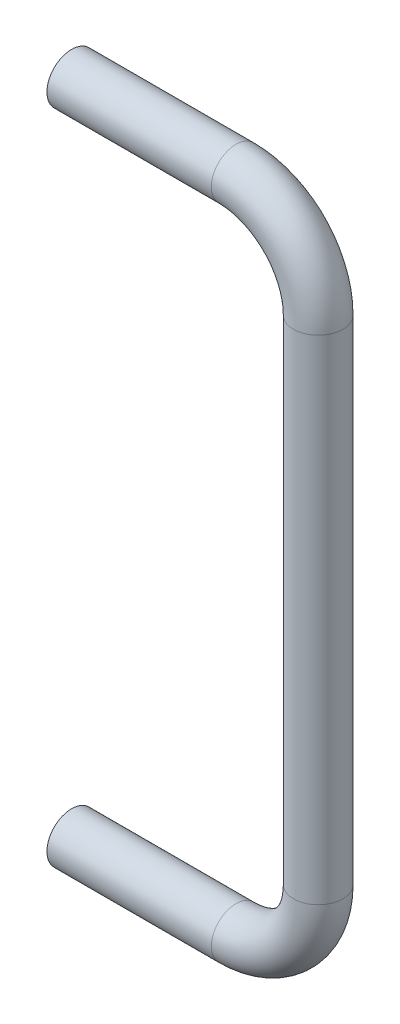
ISO-10303-21;
HEADER;
FILE_DESCRIPTION(('STEP AP214'),'2;1');
FILE_NAME('part.step','',(''),(''),'','','');
FILE_SCHEMA(('AUTOMOTIVE_DESIGN { 1 0 10303 214 1 1 1 1 }'));
ENDSEC;
DATA;
#1=APPLICATION_CONTEXT('core data for automotive mechanical design processes');
#2=APPLICATION_PROTOCOL_DEFINITION('international standard','automotive_design',2000,#1);
#3=PRODUCT_CONTEXT('',#1,'mechanical');
#4=PRODUCT('Part','Part','',(#3));
#5=PRODUCT_RELATED_PRODUCT_CATEGORY('part','',(#4));
#6=PRODUCT_DEFINITION_FORMATION('','',#4);
#7=PRODUCT_DEFINITION_CONTEXT('part definition',#1,'design');
#8=PRODUCT_DEFINITION('design','',#6,#7);
#9=PRODUCT_DEFINITION_SHAPE('','',#8);
#10=(LENGTH_UNIT() NAMED_UNIT(*) SI_UNIT(.MILLI.,.METRE.));
#11=(NAMED_UNIT(*) PLANE_ANGLE_UNIT() SI_UNIT($,.RADIAN.));
#12=(NAMED_UNIT(*) SI_UNIT($,.STERADIAN.) SOLID_ANGLE_UNIT());
#13=UNCERTAINTY_MEASURE_WITH_UNIT(LENGTH_MEASURE(1.E-05),#10,'distance_accuracy_value','');
#14=(GEOMETRIC_REPRESENTATION_CONTEXT(3) GLOBAL_UNCERTAINTY_ASSIGNED_CONTEXT((#13)) GLOBAL_UNIT_ASSIGNED_CONTEXT((#10,
#11,#12)) REPRESENTATION_CONTEXT('',''));
#15=CARTESIAN_POINT('',(0.,0.,0.));
#16=DIRECTION('',(0.,0.,1.));
#17=DIRECTION('',(1.,0.,0.));
#18=AXIS2_PLACEMENT_3D('',#15,#16,#17);
#19=CARTESIAN_POINT('',(0.,0.,0.));
#20=DIRECTION('',(1.,0.,0.));
#21=DIRECTION('',(0.,0.,-1.));
#22=AXIS2_PLACEMENT_3D('',#19,#20,#21);
#23=PLANE('',#22);
#24=CARTESIAN_POINT('',(0.,0.,0.));
#25=DIRECTION('',(1.,0.,0.));
#26=DIRECTION('',(0.,0.,-1.));
#27=AXIS2_PLACEMENT_3D('',#24,#25,#26);
#28=CIRCLE('',#27,3.);
#29=CARTESIAN_POINT('',(0.,0.,-3.));
#30=VERTEX_POINT('',#29);
#31=EDGE_CURVE('E64',#30,#30,#28,.T.);
#32=ORIENTED_EDGE('',*,*,#31,.F.);
#33=EDGE_LOOP('',(#32));
#34=FACE_BOUND('',#33,.T.);
#35=ADVANCED_FACE('F37',(#34),#23,.F.);
#36=CARTESIAN_POINT('',(0.,80.,0.));
#37=DIRECTION('',(-1.,0.,0.));
#38=DIRECTION('',(0.,0.,-1.));
#39=AXIS2_PLACEMENT_3D('',#36,#37,#38);
#40=PLANE('',#39);
#41=CARTESIAN_POINT('',(0.,80.,0.));
#42=DIRECTION('',(-1.,0.,0.));
#43=DIRECTION('',(0.,0.,-1.));
#44=AXIS2_PLACEMENT_3D('',#41,#42,#43);
#45=CIRCLE('',#44,3.);
#46=CARTESIAN_POINT('',(0.,80.,-3.));
#47=VERTEX_POINT('',#46);
#48=EDGE_CURVE('E10',#47,#47,#45,.T.);
#49=ORIENTED_EDGE('',*,*,#48,.T.);
#50=EDGE_LOOP('',(#49));
#51=FACE_BOUND('',#50,.T.);
#52=ADVANCED_FACE('F72',(#51),#40,.T.);
#53=CARTESIAN_POINT('',(0.,0.,0.));
#54=DIRECTION('',(1.,0.,0.));
#55=DIRECTION('',(0.,0.,-1.));
#56=AXIS2_PLACEMENT_3D('',#53,#54,#55);
#57=CYLINDRICAL_SURFACE('',#56,3.);
#58=CARTESIAN_POINT('',(20.,0.,0.));
#59=DIRECTION('',(1.,0.,0.));
#60=DIRECTION('',(0.,0.,-1.));
#61=AXIS2_PLACEMENT_3D('',#58,#59,#60);
#62=CIRCLE('',#61,3.);
#63=CARTESIAN_POINT('',(20.,-3.,0.));
#64=VERTEX_POINT('',#63);
#65=EDGE_CURVE('E60',#64,#64,#62,.T.);
#66=ORIENTED_EDGE('',*,*,#65,.F.);
#67=EDGE_LOOP('',(#66));
#68=FACE_BOUND('',#67,.T.);
#69=ORIENTED_EDGE('',*,*,#31,.T.);
#70=EDGE_LOOP('',(#69));
#71=FACE_BOUND('',#70,.T.);
#72=ADVANCED_FACE('F69',(#68,#71),#57,.T.);
#73=CARTESIAN_POINT('',(20.,10.,0.));
#74=DIRECTION('',(0.,0.,1.));
#75=DIRECTION('',(1.,0.,0.));
#76=AXIS2_PLACEMENT_3D('',#73,#74,#75);
#77=TOROIDAL_SURFACE('',#76,10.,3.);
#78=CARTESIAN_POINT('',(30.,10.,0.));
#79=DIRECTION('',(0.,1.,0.));
#80=DIRECTION('',(0.,0.,-1.));
#81=AXIS2_PLACEMENT_3D('',#78,#79,#80);
#82=CIRCLE('',#81,3.);
#83=CARTESIAN_POINT('',(33.,10.,0.));
#84=VERTEX_POINT('',#83);
#85=EDGE_CURVE('E54',#84,#84,#82,.T.);
#86=CARTESIAN_POINT('',(20.,10.,0.));
#87=DIRECTION('',(0.,0.,1.));
#88=DIRECTION('',(1.,0.,0.));
#89=AXIS2_PLACEMENT_3D('',#86,#87,#88);
#90=CIRCLE('',#89,13.);
#91=EDGE_CURVE('',#64,#84,#90,.T.);
#92=ORIENTED_EDGE('',*,*,#65,.T.);
#93=ORIENTED_EDGE('',*,*,#85,.F.);
#94=ORIENTED_EDGE('',*,*,#91,.T.);
#95=ORIENTED_EDGE('',*,*,#91,.F.);
#96=EDGE_LOOP('',(#92,#94,#93,#95));
#97=FACE_BOUND('',#96,.T.);
#98=ADVANCED_FACE('F90',(#97),#77,.T.);
#99=CARTESIAN_POINT('',(30.,10.,0.));
#100=DIRECTION('',(0.,1.,0.));
#101=DIRECTION('',(0.,0.,1.));
#102=AXIS2_PLACEMENT_3D('',#99,#100,#101);
#103=CYLINDRICAL_SURFACE('',#102,3.);
#104=CARTESIAN_POINT('',(30.,70.,0.));
#105=DIRECTION('',(0.,1.,0.));
#106=DIRECTION('',(0.,0.,-1.));
#107=AXIS2_PLACEMENT_3D('',#104,#105,#106);
#108=CIRCLE('',#107,3.);
#109=CARTESIAN_POINT('',(33.,70.,0.));
#110=VERTEX_POINT('',#109);
#111=EDGE_CURVE('E49',#110,#110,#108,.T.);
#112=ORIENTED_EDGE('',*,*,#111,.F.);
#113=EDGE_LOOP('',(#112));
#114=FACE_BOUND('',#113,.T.);
#115=ORIENTED_EDGE('',*,*,#85,.T.);
#116=EDGE_LOOP('',(#115));
#117=FACE_BOUND('',#116,.T.);
#118=ADVANCED_FACE('F84',(#114,#117),#103,.T.);
#119=CARTESIAN_POINT('',(20.,70.,0.));
#120=DIRECTION('',(0.,0.,1.));
#121=DIRECTION('',(1.,0.,0.));
#122=AXIS2_PLACEMENT_3D('',#119,#120,#121);
#123=TOROIDAL_SURFACE('',#122,10.,3.);
#124=CARTESIAN_POINT('',(20.,80.,0.));
#125=DIRECTION('',(-1.,0.,0.));
#126=DIRECTION('',(0.,0.,-1.));
#127=AXIS2_PLACEMENT_3D('',#124,#125,#126);
#128=CIRCLE('',#127,3.);
#129=CARTESIAN_POINT('',(20.,83.,0.));
#130=VERTEX_POINT('',#129);
#131=EDGE_CURVE('E44',#130,#130,#128,.T.);
#132=CARTESIAN_POINT('',(20.,70.,0.));
#133=DIRECTION('',(0.,0.,1.));
#134=DIRECTION('',(1.,0.,0.));
#135=AXIS2_PLACEMENT_3D('',#132,#133,#134);
#136=CIRCLE('',#135,13.);
#137=EDGE_CURVE('',#110,#130,#136,.T.);
#138=ORIENTED_EDGE('',*,*,#111,.T.);
#139=ORIENTED_EDGE('',*,*,#131,.F.);
#140=ORIENTED_EDGE('',*,*,#137,.T.);
#141=ORIENTED_EDGE('',*,*,#137,.F.);
#142=EDGE_LOOP('',(#138,#140,#139,#141));
#143=FACE_BOUND('',#142,.T.);
#144=ADVANCED_FACE('F78',(#143),#123,.T.);
#145=CARTESIAN_POINT('',(20.,80.,0.));
#146=DIRECTION('',(-1.,0.,0.));
#147=DIRECTION('',(0.,-1.,0.));
#148=AXIS2_PLACEMENT_3D('',#145,#146,#147);
#149=CYLINDRICAL_SURFACE('',#148,3.);
#150=ORIENTED_EDGE('',*,*,#48,.F.);
#151=EDGE_LOOP('',(#150));
#152=FACE_BOUND('',#151,.T.);
#153=ORIENTED_EDGE('',*,*,#131,.T.);
#154=EDGE_LOOP('',(#153));
#155=FACE_BOUND('',#154,.T.);
#156=ADVANCED_FACE('F76',(#152,#155),#149,.T.);
#157=CLOSED_SHELL('',(#35,#52,#72,#98,#118,#144,#156));
#158=MANIFOLD_SOLID_BREP('B2',#157);
#159=ADVANCED_BREP_SHAPE_REPRESENTATION('',(#18,#158),#14);
#160=SHAPE_DEFINITION_REPRESENTATION(#9,#159);
ENDSEC;
END-ISO-10303-21;
